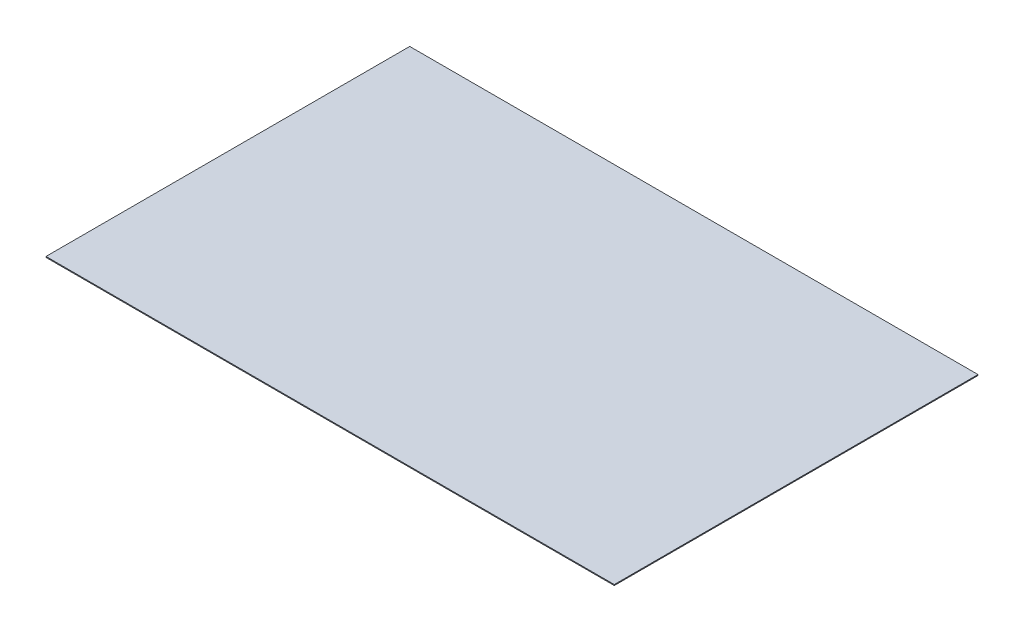
ISO-10303-21;
HEADER;
FILE_DESCRIPTION(('STEP AP214'),'2;1');
FILE_NAME('part.step','',(''),(''),'','','');
FILE_SCHEMA(('AUTOMOTIVE_DESIGN { 1 0 10303 214 1 1 1 1 }'));
ENDSEC;
DATA;
#1=APPLICATION_CONTEXT('core data for automotive mechanical design processes');
#2=APPLICATION_PROTOCOL_DEFINITION('international standard','automotive_design',2000,#1);
#3=PRODUCT_CONTEXT('',#1,'mechanical');
#4=PRODUCT('Part','Part','',(#3));
#5=PRODUCT_RELATED_PRODUCT_CATEGORY('part','',(#4));
#6=PRODUCT_DEFINITION_FORMATION('','',#4);
#7=PRODUCT_DEFINITION_CONTEXT('part definition',#1,'design');
#8=PRODUCT_DEFINITION('design','',#6,#7);
#9=PRODUCT_DEFINITION_SHAPE('','',#8);
#10=(LENGTH_UNIT() NAMED_UNIT(*) SI_UNIT(.MILLI.,.METRE.));
#11=(NAMED_UNIT(*) PLANE_ANGLE_UNIT() SI_UNIT($,.RADIAN.));
#12=(NAMED_UNIT(*) SI_UNIT($,.STERADIAN.) SOLID_ANGLE_UNIT());
#13=UNCERTAINTY_MEASURE_WITH_UNIT(LENGTH_MEASURE(1.E-05),#10,'distance_accuracy_value','');
#14=(GEOMETRIC_REPRESENTATION_CONTEXT(3) GLOBAL_UNCERTAINTY_ASSIGNED_CONTEXT((#13)) GLOBAL_UNIT_ASSIGNED_CONTEXT((#10,
#11,#12)) REPRESENTATION_CONTEXT('',''));
#15=CARTESIAN_POINT('',(0.,0.,0.));
#16=DIRECTION('',(0.,0.,1.));
#17=DIRECTION('',(1.,0.,0.));
#18=AXIS2_PLACEMENT_3D('',#15,#16,#17);
#19=CARTESIAN_POINT('',(0.,2.,0.));
#20=DIRECTION('',(1.,0.,0.));
#21=DIRECTION('',(0.,0.,-1.));
#22=AXIS2_PLACEMENT_3D('',#19,#20,#21);
#23=PLANE('',#22);
#24=DIRECTION('',(0.,0.,1.));
#25=VECTOR('',#24,1.);
#26=CARTESIAN_POINT('',(0.,0.,0.));
#27=LINE('',#26,#25);
#28=CARTESIAN_POINT('',(0.,0.,-800.));
#29=VERTEX_POINT('',#28);
#30=CARTESIAN_POINT('',(0.,0.,0.));
#31=VERTEX_POINT('',#30);
#32=EDGE_CURVE('E114',#29,#31,#27,.T.);
#33=ORIENTED_EDGE('',*,*,#32,.T.);
#34=DIRECTION('',(0.,-1.,0.));
#35=VECTOR('',#34,1.);
#36=CARTESIAN_POINT('',(0.,2.,0.));
#37=LINE('',#36,#35);
#38=CARTESIAN_POINT('',(0.,2.,0.));
#39=VERTEX_POINT('',#38);
#40=EDGE_CURVE('E11',#39,#31,#37,.T.);
#41=ORIENTED_EDGE('',*,*,#40,.F.);
#42=DIRECTION('',(0.,0.,1.));
#43=VECTOR('',#42,1.);
#44=CARTESIAN_POINT('',(0.,2.,0.));
#45=LINE('',#44,#43);
#46=CARTESIAN_POINT('',(0.,2.,-800.));
#47=VERTEX_POINT('',#46);
#48=EDGE_CURVE('E100',#47,#39,#45,.T.);
#49=ORIENTED_EDGE('',*,*,#48,.F.);
#50=DIRECTION('',(0.,-1.,0.));
#51=VECTOR('',#50,1.);
#52=CARTESIAN_POINT('',(0.,2.,-800.));
#53=LINE('',#52,#51);
#54=EDGE_CURVE('E108',#47,#29,#53,.T.);
#55=ORIENTED_EDGE('',*,*,#54,.T.);
#56=EDGE_LOOP('',(#33,#41,#49,#55));
#57=FACE_BOUND('',#56,.T.);
#58=ADVANCED_FACE('F44',(#57),#23,.F.);
#59=CARTESIAN_POINT('',(0.,2.,0.));
#60=DIRECTION('',(0.,0.,-1.));
#61=DIRECTION('',(-1.,0.,0.));
#62=AXIS2_PLACEMENT_3D('',#59,#60,#61);
#63=PLANE('',#62);
#64=DIRECTION('',(1.,0.,0.));
#65=VECTOR('',#64,1.);
#66=CARTESIAN_POINT('',(0.,0.,0.));
#67=LINE('',#66,#65);
#68=CARTESIAN_POINT('',(1250.,0.,0.));
#69=VERTEX_POINT('',#68);
#70=EDGE_CURVE('E105',#31,#69,#67,.T.);
#71=ORIENTED_EDGE('',*,*,#70,.T.);
#72=DIRECTION('',(0.,-1.,0.));
#73=VECTOR('',#72,1.);
#74=CARTESIAN_POINT('',(1250.,2.,0.));
#75=LINE('',#74,#73);
#76=CARTESIAN_POINT('',(1250.,2.,0.));
#77=VERTEX_POINT('',#76);
#78=EDGE_CURVE('E53',#77,#69,#75,.T.);
#79=ORIENTED_EDGE('',*,*,#78,.F.);
#80=DIRECTION('',(1.,0.,0.));
#81=VECTOR('',#80,1.);
#82=CARTESIAN_POINT('',(0.,2.,0.));
#83=LINE('',#82,#81);
#84=EDGE_CURVE('E95',#39,#77,#83,.T.);
#85=ORIENTED_EDGE('',*,*,#84,.F.);
#86=ORIENTED_EDGE('',*,*,#40,.T.);
#87=EDGE_LOOP('',(#71,#79,#85,#86));
#88=FACE_BOUND('',#87,.T.);
#89=ADVANCED_FACE('F101',(#88),#63,.F.);
#90=CARTESIAN_POINT('',(1250.,2.,0.));
#91=DIRECTION('',(-1.,0.,0.));
#92=DIRECTION('',(0.,0.,1.));
#93=AXIS2_PLACEMENT_3D('',#90,#91,#92);
#94=PLANE('',#93);
#95=DIRECTION('',(0.,0.,-1.));
#96=VECTOR('',#95,1.);
#97=CARTESIAN_POINT('',(1250.,0.,0.));
#98=LINE('',#97,#96);
#99=CARTESIAN_POINT('',(1250.,0.,-800.));
#100=VERTEX_POINT('',#99);
#101=EDGE_CURVE('E78',#69,#100,#98,.T.);
#102=ORIENTED_EDGE('',*,*,#101,.T.);
#103=DIRECTION('',(0.,-1.,0.));
#104=VECTOR('',#103,1.);
#105=CARTESIAN_POINT('',(1250.,2.,-800.));
#106=LINE('',#105,#104);
#107=CARTESIAN_POINT('',(1250.,2.,-800.));
#108=VERTEX_POINT('',#107);
#109=EDGE_CURVE('E102',#108,#100,#106,.T.);
#110=ORIENTED_EDGE('',*,*,#109,.F.);
#111=DIRECTION('',(0.,0.,-1.));
#112=VECTOR('',#111,1.);
#113=CARTESIAN_POINT('',(1250.,2.,0.));
#114=LINE('',#113,#112);
#115=EDGE_CURVE('E92',#77,#108,#114,.T.);
#116=ORIENTED_EDGE('',*,*,#115,.F.);
#117=ORIENTED_EDGE('',*,*,#78,.T.);
#118=EDGE_LOOP('',(#102,#110,#116,#117));
#119=FACE_BOUND('',#118,.T.);
#120=ADVANCED_FACE('F104',(#119),#94,.F.);
#121=CARTESIAN_POINT('',(0.,2.,-800.));
#122=DIRECTION('',(0.,0.,1.));
#123=DIRECTION('',(1.,0.,0.));
#124=AXIS2_PLACEMENT_3D('',#121,#122,#123);
#125=PLANE('',#124);
#126=DIRECTION('',(-1.,0.,0.));
#127=VECTOR('',#126,1.);
#128=CARTESIAN_POINT('',(0.,0.,-800.));
#129=LINE('',#128,#127);
#130=EDGE_CURVE('E83',#100,#29,#129,.T.);
#131=ORIENTED_EDGE('',*,*,#130,.T.);
#132=ORIENTED_EDGE('',*,*,#54,.F.);
#133=DIRECTION('',(-1.,0.,0.));
#134=VECTOR('',#133,1.);
#135=CARTESIAN_POINT('',(0.,2.,-800.));
#136=LINE('',#135,#134);
#137=EDGE_CURVE('E61',#108,#47,#136,.T.);
#138=ORIENTED_EDGE('',*,*,#137,.F.);
#139=ORIENTED_EDGE('',*,*,#109,.T.);
#140=EDGE_LOOP('',(#131,#132,#138,#139));
#141=FACE_BOUND('',#140,.T.);
#142=ADVANCED_FACE('F127',(#141),#125,.F.);
#143=CARTESIAN_POINT('',(0.,2.,0.));
#144=DIRECTION('',(0.,-1.,0.));
#145=DIRECTION('',(0.,0.,-1.));
#146=AXIS2_PLACEMENT_3D('',#143,#144,#145);
#147=PLANE('',#146);
#148=ORIENTED_EDGE('',*,*,#48,.T.);
#149=ORIENTED_EDGE('',*,*,#84,.T.);
#150=ORIENTED_EDGE('',*,*,#115,.T.);
#151=ORIENTED_EDGE('',*,*,#137,.T.);
#152=EDGE_LOOP('',(#148,#149,#150,#151));
#153=FACE_BOUND('',#152,.T.);
#154=ADVANCED_FACE('F91',(#153),#147,.F.);
#155=CARTESIAN_POINT('',(0.,0.,0.));
#156=DIRECTION('',(0.,-1.,0.));
#157=DIRECTION('',(0.,0.,-1.));
#158=AXIS2_PLACEMENT_3D('',#155,#156,#157);
#159=PLANE('',#158);
#160=ORIENTED_EDGE('',*,*,#32,.F.);
#161=ORIENTED_EDGE('',*,*,#130,.F.);
#162=ORIENTED_EDGE('',*,*,#101,.F.);
#163=ORIENTED_EDGE('',*,*,#70,.F.);
#164=EDGE_LOOP('',(#160,#161,#162,#163));
#165=FACE_BOUND('',#164,.T.);
#166=ADVANCED_FACE('F129',(#165),#159,.T.);
#167=CLOSED_SHELL('',(#58,#89,#120,#142,#154,#166));
#168=MANIFOLD_SOLID_BREP('B2',#167);
#169=ADVANCED_BREP_SHAPE_REPRESENTATION('',(#18,#168),#14);
#170=SHAPE_DEFINITION_REPRESENTATION(#9,#169);
ENDSEC;
END-ISO-10303-21;
